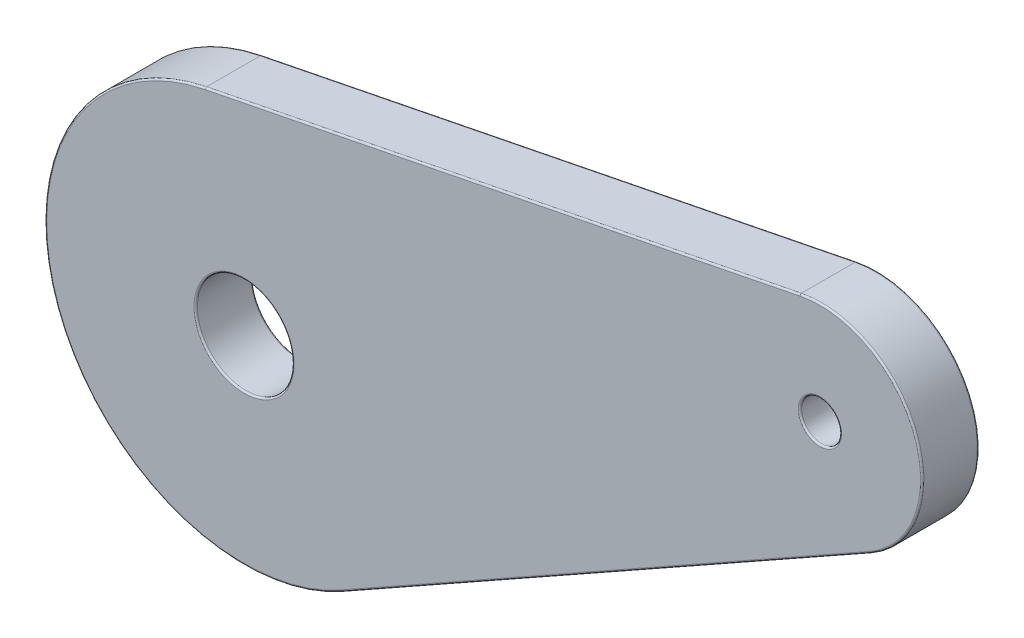
ISO-10303-21;
HEADER;
FILE_DESCRIPTION(('STEP AP214'),'2;1');
FILE_NAME('part.step','',(''),(''),'','','');
FILE_SCHEMA(('AUTOMOTIVE_DESIGN { 1 0 10303 214 1 1 1 1 }'));
ENDSEC;
DATA;
#1=APPLICATION_CONTEXT('core data for automotive mechanical design processes');
#2=APPLICATION_PROTOCOL_DEFINITION('international standard','automotive_design',2000,#1);
#3=PRODUCT_CONTEXT('',#1,'mechanical');
#4=PRODUCT('Part','Part','',(#3));
#5=PRODUCT_RELATED_PRODUCT_CATEGORY('part','',(#4));
#6=PRODUCT_DEFINITION_FORMATION('','',#4);
#7=PRODUCT_DEFINITION_CONTEXT('part definition',#1,'design');
#8=PRODUCT_DEFINITION('design','',#6,#7);
#9=PRODUCT_DEFINITION_SHAPE('','',#8);
#10=(LENGTH_UNIT() NAMED_UNIT(*) SI_UNIT(.MILLI.,.METRE.));
#11=(NAMED_UNIT(*) PLANE_ANGLE_UNIT() SI_UNIT($,.RADIAN.));
#12=(NAMED_UNIT(*) SI_UNIT($,.STERADIAN.) SOLID_ANGLE_UNIT());
#13=UNCERTAINTY_MEASURE_WITH_UNIT(LENGTH_MEASURE(1.E-05),#10,'distance_accuracy_value','');
#14=(GEOMETRIC_REPRESENTATION_CONTEXT(3) GLOBAL_UNCERTAINTY_ASSIGNED_CONTEXT((#13)) GLOBAL_UNIT_ASSIGNED_CONTEXT((#10,
#11,#12)) REPRESENTATION_CONTEXT('',''));
#15=CARTESIAN_POINT('',(0.,0.,0.));
#16=DIRECTION('',(0.,0.,1.));
#17=DIRECTION('',(1.,0.,0.));
#18=AXIS2_PLACEMENT_3D('',#15,#16,#17);
#19=CARTESIAN_POINT('',(-20.2200000000001,57.5800000000001,5.));
#20=DIRECTION('',(0.,0.,1.));
#21=DIRECTION('',(1.,0.,0.));
#22=AXIS2_PLACEMENT_3D('',#19,#20,#21);
#23=PLANE('',#22);
#24=CARTESIAN_POINT('',(-20.2200000000001,57.5800000000001,5.));
#25=DIRECTION('',(0.,0.,1.));
#26=DIRECTION('',(1.,0.,0.));
#27=AXIS2_PLACEMENT_3D('',#24,#25,#26);
#28=CIRCLE('',#27,4.4);
#29=CARTESIAN_POINT('',(-15.8200000000001,57.5800000000001,5.));
#30=VERTEX_POINT('',#29);
#31=EDGE_CURVE('E125',#30,#30,#28,.F.);
#32=ORIENTED_EDGE('',*,*,#31,.T.);
#33=EDGE_LOOP('',(#32));
#34=FACE_BOUND('',#33,.T.);
#35=CARTESIAN_POINT('',(30.4151368034538,76.3438727584557,5.));
#36=DIRECTION('',(0.,0.,1.));
#37=DIRECTION('',(1.,0.,0.));
#38=AXIS2_PLACEMENT_3D('',#35,#36,#37);
#39=CIRCLE('',#38,8.84999999999999);
#40=CARTESIAN_POINT('',(34.7582420573843,68.6328458000486,5.));
#41=VERTEX_POINT('',#40);
#42=CARTESIAN_POINT('',(28.6845337210184,85.0230151683407,5.));
#43=VERTEX_POINT('',#42);
#44=EDGE_CURVE('E123',#41,#43,#39,.T.);
#45=ORIENTED_EDGE('',*,*,#44,.T.);
#46=DIRECTION('',(-0.980694057614127,-0.195548370896662,0.));
#47=VECTOR('',#46,1.);
#48=CARTESIAN_POINT('',(-23.6127642350572,74.5950418996051,5.));
#49=LINE('',#48,#47);
#50=CARTESIAN_POINT('',(-23.6127642350572,74.5950418996051,5.));
#51=VERTEX_POINT('',#50);
#52=EDGE_CURVE('E104',#43,#51,#49,.T.);
#53=ORIENTED_EDGE('',*,*,#52,.T.);
#54=CARTESIAN_POINT('',(-20.2200000000001,57.5800000000001,5.));
#55=DIRECTION('',(0.,0.,1.));
#56=DIRECTION('',(1.,0.,0.));
#57=AXIS2_PLACEMENT_3D('',#54,#55,#56);
#58=CIRCLE('',#57,17.35);
#59=CARTESIAN_POINT('',(-11.7055507168708,42.4629019515975,5.));
#60=VERTEX_POINT('',#59);
#61=EDGE_CURVE('E112',#51,#60,#58,.T.);
#62=ORIENTED_EDGE('',*,*,#61,.T.);
#63=DIRECTION('',(0.871302481175943,0.490746356376331,0.));
#64=VECTOR('',#63,1.);
#65=CARTESIAN_POINT('',(34.7582420573843,68.6328458000486,5.));
#66=LINE('',#65,#64);
#67=EDGE_CURVE('E118',#60,#41,#66,.T.);
#68=ORIENTED_EDGE('',*,*,#67,.T.);
#69=EDGE_LOOP('',(#45,#53,#62,#68));
#70=FACE_BOUND('',#69,.T.);
#71=CARTESIAN_POINT('',(30.4151368034538,76.3438727584557,5.));
#72=DIRECTION('',(0.,0.,1.));
#73=DIRECTION('',(1.,0.,0.));
#74=AXIS2_PLACEMENT_3D('',#71,#72,#73);
#75=CIRCLE('',#74,1.90000000000003);
#76=CARTESIAN_POINT('',(32.3151368034539,76.3438727584557,5.));
#77=VERTEX_POINT('',#76);
#78=EDGE_CURVE('E119',#77,#77,#75,.F.);
#79=ORIENTED_EDGE('',*,*,#78,.T.);
#80=EDGE_LOOP('',(#79));
#81=FACE_BOUND('',#80,.T.);
#82=ADVANCED_FACE('F32',(#34,#70,#81),#23,.T.);
#83=CARTESIAN_POINT('',(-20.2200000000001,57.5800000000001,0.));
#84=DIRECTION('',(0.,0.,1.));
#85=DIRECTION('',(1.,0.,0.));
#86=AXIS2_PLACEMENT_3D('',#83,#84,#85);
#87=PLANE('',#86);
#88=CARTESIAN_POINT('',(-20.2200000000001,57.5800000000001,0.));
#89=DIRECTION('',(0.,0.,1.));
#90=DIRECTION('',(1.,0.,0.));
#91=AXIS2_PLACEMENT_3D('',#88,#89,#90);
#92=CIRCLE('',#91,4.4);
#93=CARTESIAN_POINT('',(-15.8200000000001,57.5800000000001,0.));
#94=VERTEX_POINT('',#93);
#95=EDGE_CURVE('E11',#94,#94,#92,.T.);
#96=ORIENTED_EDGE('',*,*,#95,.T.);
#97=EDGE_LOOP('',(#96));
#98=FACE_BOUND('',#97,.T.);
#99=CARTESIAN_POINT('',(30.4151368034538,76.3438727584557,0.));
#100=DIRECTION('',(0.,0.,1.));
#101=DIRECTION('',(1.,0.,0.));
#102=AXIS2_PLACEMENT_3D('',#99,#100,#101);
#103=CIRCLE('',#102,1.90000000000003);
#104=CARTESIAN_POINT('',(32.3151368034539,76.3438727584557,0.));
#105=VERTEX_POINT('',#104);
#106=EDGE_CURVE('E41',#105,#105,#103,.T.);
#107=ORIENTED_EDGE('',*,*,#106,.T.);
#108=EDGE_LOOP('',(#107));
#109=FACE_BOUND('',#108,.T.);
#110=CARTESIAN_POINT('',(30.4151368034538,76.3438727584557,0.));
#111=DIRECTION('',(0.,0.,1.));
#112=DIRECTION('',(1.,0.,0.));
#113=AXIS2_PLACEMENT_3D('',#110,#111,#112);
#114=CIRCLE('',#113,8.84999999999999);
#115=CARTESIAN_POINT('',(28.6845337210184,85.0230151683407,0.));
#116=VERTEX_POINT('',#115);
#117=CARTESIAN_POINT('',(34.7582420573843,68.6328458000486,0.));
#118=VERTEX_POINT('',#117);
#119=EDGE_CURVE('E49',#116,#118,#114,.F.);
#120=ORIENTED_EDGE('',*,*,#119,.T.);
#121=DIRECTION('',(0.871302481175943,0.490746356376331,0.));
#122=VECTOR('',#121,1.);
#123=CARTESIAN_POINT('',(-11.7055507168708,42.4629019515975,0.));
#124=LINE('',#123,#122);
#125=CARTESIAN_POINT('',(-11.7055507168708,42.4629019515975,0.));
#126=VERTEX_POINT('',#125);
#127=EDGE_CURVE('E158',#118,#126,#124,.F.);
#128=ORIENTED_EDGE('',*,*,#127,.T.);
#129=CARTESIAN_POINT('',(-20.2200000000001,57.5800000000001,0.));
#130=DIRECTION('',(0.,0.,1.));
#131=DIRECTION('',(1.,0.,0.));
#132=AXIS2_PLACEMENT_3D('',#129,#130,#131);
#133=CIRCLE('',#132,17.35);
#134=CARTESIAN_POINT('',(-23.6127642350572,74.5950418996051,0.));
#135=VERTEX_POINT('',#134);
#136=EDGE_CURVE('E154',#126,#135,#133,.F.);
#137=ORIENTED_EDGE('',*,*,#136,.T.);
#138=DIRECTION('',(-0.980694057614127,-0.195548370896662,0.));
#139=VECTOR('',#138,1.);
#140=CARTESIAN_POINT('',(-23.6127642350572,74.5950418996051,0.));
#141=LINE('',#140,#139);
#142=EDGE_CURVE('E54',#135,#116,#141,.F.);
#143=ORIENTED_EDGE('',*,*,#142,.T.);
#144=EDGE_LOOP('',(#120,#128,#137,#143));
#145=FACE_BOUND('',#144,.T.);
#146=ADVANCED_FACE('F189',(#98,#109,#145),#87,.F.);
#147=CARTESIAN_POINT('',(-20.2200000000001,57.5800000000001,5.));
#148=DIRECTION('',(0.,0.,-1.));
#149=DIRECTION('',(-1.,0.,0.));
#150=AXIS2_PLACEMENT_3D('',#147,#148,#149);
#151=CYLINDRICAL_SURFACE('',#150,17.5);
#152=DIRECTION('',(0.,0.,-1.));
#153=VECTOR('',#152,1.);
#154=CARTESIAN_POINT('',(-11.6319387634143,42.3322065794211,5.));
#155=LINE('',#154,#153);
#156=CARTESIAN_POINT('',(-11.6319387634143,42.3322065794211,4.85));
#157=VERTEX_POINT('',#156);
#158=CARTESIAN_POINT('',(-11.6319387634143,42.3322065794211,0.15));
#159=VERTEX_POINT('',#158);
#160=EDGE_CURVE('E388',#157,#159,#155,.T.);
#161=ORIENTED_EDGE('',*,*,#160,.F.);
#162=CARTESIAN_POINT('',(-20.2200000000001,57.5800000000001,4.85));
#163=DIRECTION('',(0.,0.,1.));
#164=DIRECTION('',(1.,0.,0.));
#165=AXIS2_PLACEMENT_3D('',#162,#163,#164);
#166=CIRCLE('',#165,17.5);
#167=CARTESIAN_POINT('',(-23.6420964906917,74.7421460082473,4.85));
#168=VERTEX_POINT('',#167);
#169=EDGE_CURVE('E146',#157,#168,#166,.F.);
#170=ORIENTED_EDGE('',*,*,#169,.T.);
#171=DIRECTION('',(0.,0.,-1.));
#172=VECTOR('',#171,1.);
#173=CARTESIAN_POINT('',(-23.6420964906917,74.7421460082473,5.));
#174=LINE('',#173,#172);
#175=CARTESIAN_POINT('',(-23.6420964906917,74.7421460082473,0.15));
#176=VERTEX_POINT('',#175);
#177=EDGE_CURVE('E167',#168,#176,#174,.T.);
#178=ORIENTED_EDGE('',*,*,#177,.T.);
#179=CARTESIAN_POINT('',(-20.2200000000001,57.5800000000001,0.15));
#180=DIRECTION('',(0.,0.,1.));
#181=DIRECTION('',(1.,0.,0.));
#182=AXIS2_PLACEMENT_3D('',#179,#180,#181);
#183=CIRCLE('',#182,17.5);
#184=EDGE_CURVE('E144',#176,#159,#183,.T.);
#185=ORIENTED_EDGE('',*,*,#184,.T.);
#186=EDGE_LOOP('',(#161,#170,#178,#185));
#187=FACE_BOUND('',#186,.T.);
#188=ADVANCED_FACE('F191',(#187),#151,.T.);
#189=CARTESIAN_POINT('',(34.8318540108408,68.5021504278722,5.));
#190=DIRECTION('',(-0.490746356376331,0.871302481175943,0.));
#191=DIRECTION('',(-0.871302481175943,-0.490746356376331,0.));
#192=AXIS2_PLACEMENT_3D('',#189,#190,#191);
#193=PLANE('',#192);
#194=DIRECTION('',(0.,0.,-1.));
#195=VECTOR('',#194,1.);
#196=CARTESIAN_POINT('',(34.8318540108408,68.5021504278722,5.));
#197=LINE('',#196,#195);
#198=CARTESIAN_POINT('',(34.8318540108408,68.5021504278722,4.85));
#199=VERTEX_POINT('',#198);
#200=CARTESIAN_POINT('',(34.8318540108408,68.5021504278722,0.15));
#201=VERTEX_POINT('',#200);
#202=EDGE_CURVE('E392',#199,#201,#197,.T.);
#203=ORIENTED_EDGE('',*,*,#202,.F.);
#204=DIRECTION('',(0.871302481175943,0.490746356376331,0.));
#205=VECTOR('',#204,1.);
#206=CARTESIAN_POINT('',(-11.6319387634143,42.3322065794211,4.85));
#207=LINE('',#206,#205);
#208=EDGE_CURVE('E142',#199,#157,#207,.F.);
#209=ORIENTED_EDGE('',*,*,#208,.T.);
#210=ORIENTED_EDGE('',*,*,#160,.T.);
#211=DIRECTION('',(0.871302481175943,0.490746356376331,0.));
#212=VECTOR('',#211,1.);
#213=CARTESIAN_POINT('',(34.8318540108408,68.5021504278722,0.15));
#214=LINE('',#213,#212);
#215=EDGE_CURVE('E139',#159,#201,#214,.T.);
#216=ORIENTED_EDGE('',*,*,#215,.T.);
#217=EDGE_LOOP('',(#203,#209,#210,#216));
#218=FACE_BOUND('',#217,.T.);
#219=ADVANCED_FACE('F198',(#218),#193,.F.);
#220=CARTESIAN_POINT('',(30.4151368034538,76.3438727584557,5.));
#221=DIRECTION('',(0.,0.,-1.));
#222=DIRECTION('',(-1.,0.,0.));
#223=AXIS2_PLACEMENT_3D('',#220,#221,#222);
#224=CYLINDRICAL_SURFACE('',#223,8.99999999999999);
#225=DIRECTION('',(0.,0.,-1.));
#226=VECTOR('',#225,1.);
#227=CARTESIAN_POINT('',(28.6552014653839,85.1701192769828,5.));
#228=LINE('',#227,#226);
#229=CARTESIAN_POINT('',(28.6552014653839,85.1701192769828,4.85));
#230=VERTEX_POINT('',#229);
#231=CARTESIAN_POINT('',(28.6552014653839,85.1701192769828,0.15));
#232=VERTEX_POINT('',#231);
#233=EDGE_CURVE('E405',#230,#232,#228,.T.);
#234=ORIENTED_EDGE('',*,*,#233,.F.);
#235=CARTESIAN_POINT('',(30.4151368034538,76.3438727584557,4.85));
#236=DIRECTION('',(0.,0.,1.));
#237=DIRECTION('',(1.,0.,0.));
#238=AXIS2_PLACEMENT_3D('',#235,#236,#237);
#239=CIRCLE('',#238,8.99999999999999);
#240=EDGE_CURVE('E137',#230,#199,#239,.F.);
#241=ORIENTED_EDGE('',*,*,#240,.T.);
#242=ORIENTED_EDGE('',*,*,#202,.T.);
#243=CARTESIAN_POINT('',(30.4151368034538,76.3438727584557,0.15));
#244=DIRECTION('',(0.,0.,1.));
#245=DIRECTION('',(1.,0.,0.));
#246=AXIS2_PLACEMENT_3D('',#243,#244,#245);
#247=CIRCLE('',#246,8.99999999999999);
#248=EDGE_CURVE('E135',#201,#232,#247,.T.);
#249=ORIENTED_EDGE('',*,*,#248,.T.);
#250=EDGE_LOOP('',(#234,#241,#242,#249));
#251=FACE_BOUND('',#250,.T.);
#252=ADVANCED_FACE('F210',(#251),#224,.T.);
#253=CARTESIAN_POINT('',(-23.6420964906917,74.7421460082473,5.));
#254=DIRECTION('',(0.195548370896662,-0.980694057614127,0.));
#255=DIRECTION('',(0.980694057614127,0.195548370896662,0.));
#256=AXIS2_PLACEMENT_3D('',#253,#254,#255);
#257=PLANE('',#256);
#258=ORIENTED_EDGE('',*,*,#177,.F.);
#259=DIRECTION('',(-0.980694057614127,-0.195548370896662,0.));
#260=VECTOR('',#259,1.);
#261=CARTESIAN_POINT('',(28.6552014653839,85.1701192769828,4.85));
#262=LINE('',#261,#260);
#263=EDGE_CURVE('E106',#168,#230,#262,.F.);
#264=ORIENTED_EDGE('',*,*,#263,.T.);
#265=ORIENTED_EDGE('',*,*,#233,.T.);
#266=DIRECTION('',(-0.980694057614127,-0.195548370896662,0.));
#267=VECTOR('',#266,1.);
#268=CARTESIAN_POINT('',(-23.6420964906917,74.7421460082473,0.15));
#269=LINE('',#268,#267);
#270=EDGE_CURVE('E128',#232,#176,#269,.T.);
#271=ORIENTED_EDGE('',*,*,#270,.T.);
#272=EDGE_LOOP('',(#258,#264,#265,#271));
#273=FACE_BOUND('',#272,.T.);
#274=ADVANCED_FACE('F206',(#273),#257,.F.);
#275=CARTESIAN_POINT('',(30.4151368034538,76.3438727584557,5.));
#276=DIRECTION('',(0.,0.,-1.));
#277=DIRECTION('',(-1.,0.,0.));
#278=AXIS2_PLACEMENT_3D('',#275,#276,#277);
#279=CYLINDRICAL_SURFACE('',#278,1.75000000000003);
#280=CARTESIAN_POINT('',(30.4151368034538,76.3438727584557,4.85));
#281=DIRECTION('',(0.,0.,1.));
#282=DIRECTION('',(1.,0.,0.));
#283=AXIS2_PLACEMENT_3D('',#280,#281,#282);
#284=CIRCLE('',#283,1.75000000000003);
#285=CARTESIAN_POINT('',(32.1651368034539,76.3438727584557,4.85));
#286=VERTEX_POINT('',#285);
#287=EDGE_CURVE('E151',#286,#286,#284,.T.);
#288=ORIENTED_EDGE('',*,*,#287,.T.);
#289=EDGE_LOOP('',(#288));
#290=FACE_BOUND('',#289,.T.);
#291=CARTESIAN_POINT('',(30.4151368034538,76.3438727584557,0.15));
#292=DIRECTION('',(0.,0.,1.));
#293=DIRECTION('',(1.,0.,0.));
#294=AXIS2_PLACEMENT_3D('',#291,#292,#293);
#295=CIRCLE('',#294,1.75000000000003);
#296=CARTESIAN_POINT('',(32.1651368034539,76.3438727584557,0.15));
#297=VERTEX_POINT('',#296);
#298=EDGE_CURVE('E148',#297,#297,#295,.F.);
#299=ORIENTED_EDGE('',*,*,#298,.T.);
#300=EDGE_LOOP('',(#299));
#301=FACE_BOUND('',#300,.T.);
#302=ADVANCED_FACE('F209',(#290,#301),#279,.F.);
#303=CARTESIAN_POINT('',(-20.2200000000001,57.5800000000001,5.));
#304=DIRECTION('',(0.,0.,-1.));
#305=DIRECTION('',(-1.,0.,0.));
#306=AXIS2_PLACEMENT_3D('',#303,#304,#305);
#307=CYLINDRICAL_SURFACE('',#306,4.25);
#308=CARTESIAN_POINT('',(-20.2200000000001,57.5800000000001,4.85));
#309=DIRECTION('',(0.,0.,1.));
#310=DIRECTION('',(1.,0.,0.));
#311=AXIS2_PLACEMENT_3D('',#308,#309,#310);
#312=CIRCLE('',#311,4.25);
#313=CARTESIAN_POINT('',(-15.9700000000001,57.5800000000001,4.85));
#314=VERTEX_POINT('',#313);
#315=EDGE_CURVE('E384',#314,#314,#312,.T.);
#316=ORIENTED_EDGE('',*,*,#315,.T.);
#317=EDGE_LOOP('',(#316));
#318=FACE_BOUND('',#317,.T.);
#319=CARTESIAN_POINT('',(-20.2200000000001,57.5800000000001,0.15));
#320=DIRECTION('',(0.,0.,1.));
#321=DIRECTION('',(1.,0.,0.));
#322=AXIS2_PLACEMENT_3D('',#319,#320,#321);
#323=CIRCLE('',#322,4.25);
#324=CARTESIAN_POINT('',(-15.9700000000001,57.5800000000001,0.15));
#325=VERTEX_POINT('',#324);
#326=EDGE_CURVE('E387',#325,#325,#323,.F.);
#327=ORIENTED_EDGE('',*,*,#326,.T.);
#328=EDGE_LOOP('',(#327));
#329=FACE_BOUND('',#328,.T.);
#330=ADVANCED_FACE('F222',(#318,#329),#307,.F.);
#331=CARTESIAN_POINT('',(-20.2200000000001,57.5800000000001,4.85));
#332=DIRECTION('',(0.,0.,1.));
#333=DIRECTION('',(1.,0.,0.));
#334=AXIS2_PLACEMENT_3D('',#331,#332,#333);
#335=TOROIDAL_SURFACE('',#334,4.4,0.15);
#336=ORIENTED_EDGE('',*,*,#31,.F.);
#337=EDGE_LOOP('',(#336));
#338=FACE_BOUND('',#337,.T.);
#339=ORIENTED_EDGE('',*,*,#315,.F.);
#340=EDGE_LOOP('',(#339));
#341=FACE_BOUND('',#340,.T.);
#342=ADVANCED_FACE('F218',(#338,#341),#335,.T.);
#343=CARTESIAN_POINT('',(-11.7055507168708,42.4629019515975,4.85));
#344=DIRECTION('',(-0.871302481175943,-0.490746356376331,0.));
#345=DIRECTION('',(0.490746356376331,-0.871302481175943,0.));
#346=AXIS2_PLACEMENT_3D('',#343,#344,#345);
#347=CYLINDRICAL_SURFACE('',#346,0.15);
#348=CARTESIAN_POINT('',(-11.7055507168708,42.4629019515975,4.85));
#349=DIRECTION('',(-0.871302481175945,-0.490746356376328,0.));
#350=DIRECTION('',(0.490746356376328,-0.871302481175945,0.));
#351=AXIS2_PLACEMENT_3D('',#348,#349,#350);
#352=CIRCLE('',#351,0.15);
#353=EDGE_CURVE('E115',#157,#60,#352,.T.);
#354=ORIENTED_EDGE('',*,*,#353,.F.);
#355=ORIENTED_EDGE('',*,*,#208,.F.);
#356=CARTESIAN_POINT('',(34.7582420573843,68.6328458000486,4.85));
#357=DIRECTION('',(0.871302481175944,0.49074635637633,0.));
#358=DIRECTION('',(-0.49074635637633,0.871302481175944,0.));
#359=AXIS2_PLACEMENT_3D('',#356,#357,#358);
#360=CIRCLE('',#359,0.15);
#361=EDGE_CURVE('E164',#41,#199,#360,.T.);
#362=ORIENTED_EDGE('',*,*,#361,.F.);
#363=ORIENTED_EDGE('',*,*,#67,.F.);
#364=EDGE_LOOP('',(#354,#355,#362,#363));
#365=FACE_BOUND('',#364,.T.);
#366=ADVANCED_FACE('F221',(#365),#347,.T.);
#367=CARTESIAN_POINT('',(30.4151368034538,76.3438727584557,4.85));
#368=DIRECTION('',(0.,0.,1.));
#369=DIRECTION('',(1.,0.,0.));
#370=AXIS2_PLACEMENT_3D('',#367,#368,#369);
#371=TOROIDAL_SURFACE('',#370,8.84999999999999,0.15);
#372=ORIENTED_EDGE('',*,*,#361,.T.);
#373=ORIENTED_EDGE('',*,*,#240,.F.);
#374=CARTESIAN_POINT('',(28.6845337210184,85.0230151683407,4.85));
#375=DIRECTION('',(-0.980694057614127,-0.195548370896665,0.));
#376=DIRECTION('',(0.195548370896665,-0.980694057614127,0.));
#377=AXIS2_PLACEMENT_3D('',#374,#375,#376);
#378=CIRCLE('',#377,0.15);
#379=EDGE_CURVE('E109',#43,#230,#378,.T.);
#380=ORIENTED_EDGE('',*,*,#379,.F.);
#381=ORIENTED_EDGE('',*,*,#44,.F.);
#382=EDGE_LOOP('',(#372,#373,#380,#381));
#383=FACE_BOUND('',#382,.T.);
#384=ADVANCED_FACE('F229',(#383),#371,.T.);
#385=CARTESIAN_POINT('',(-20.2200000000001,57.5800000000001,4.85));
#386=DIRECTION('',(0.,0.,1.));
#387=DIRECTION('',(1.,0.,0.));
#388=AXIS2_PLACEMENT_3D('',#385,#386,#387);
#389=TOROIDAL_SURFACE('',#388,17.35,0.15);
#390=ORIENTED_EDGE('',*,*,#353,.T.);
#391=ORIENTED_EDGE('',*,*,#61,.F.);
#392=CARTESIAN_POINT('',(-23.6127642350572,74.5950418996051,4.85));
#393=DIRECTION('',(0.980694057614127,0.195548370896665,0.));
#394=DIRECTION('',(-0.195548370896665,0.980694057614127,0.));
#395=AXIS2_PLACEMENT_3D('',#392,#393,#394);
#396=CIRCLE('',#395,0.15);
#397=EDGE_CURVE('E100',#168,#51,#396,.T.);
#398=ORIENTED_EDGE('',*,*,#397,.F.);
#399=ORIENTED_EDGE('',*,*,#169,.F.);
#400=EDGE_LOOP('',(#390,#391,#398,#399));
#401=FACE_BOUND('',#400,.T.);
#402=ADVANCED_FACE('F113',(#401),#389,.T.);
#403=CARTESIAN_POINT('',(-23.6127642350572,74.5950418996051,4.85));
#404=DIRECTION('',(0.980694057614127,0.195548370896662,0.));
#405=DIRECTION('',(-0.195548370896662,0.980694057614127,0.));
#406=AXIS2_PLACEMENT_3D('',#403,#404,#405);
#407=CYLINDRICAL_SURFACE('',#406,0.15);
#408=ORIENTED_EDGE('',*,*,#379,.T.);
#409=ORIENTED_EDGE('',*,*,#263,.F.);
#410=ORIENTED_EDGE('',*,*,#397,.T.);
#411=ORIENTED_EDGE('',*,*,#52,.F.);
#412=EDGE_LOOP('',(#408,#409,#410,#411));
#413=FACE_BOUND('',#412,.T.);
#414=ADVANCED_FACE('F102',(#413),#407,.T.);
#415=CARTESIAN_POINT('',(30.4151368034538,76.3438727584557,4.85));
#416=DIRECTION('',(0.,0.,1.));
#417=DIRECTION('',(1.,0.,0.));
#418=AXIS2_PLACEMENT_3D('',#415,#416,#417);
#419=TOROIDAL_SURFACE('',#418,1.90000000000003,0.15);
#420=ORIENTED_EDGE('',*,*,#78,.F.);
#421=EDGE_LOOP('',(#420));
#422=FACE_BOUND('',#421,.T.);
#423=ORIENTED_EDGE('',*,*,#287,.F.);
#424=EDGE_LOOP('',(#423));
#425=FACE_BOUND('',#424,.T.);
#426=ADVANCED_FACE('F226',(#422,#425),#419,.T.);
#427=CARTESIAN_POINT('',(-20.2200000000001,57.5800000000001,0.15));
#428=DIRECTION('',(0.,0.,1.));
#429=DIRECTION('',(1.,0.,0.));
#430=AXIS2_PLACEMENT_3D('',#427,#428,#429);
#431=TOROIDAL_SURFACE('',#430,4.4,0.15);
#432=ORIENTED_EDGE('',*,*,#326,.F.);
#433=EDGE_LOOP('',(#432));
#434=FACE_BOUND('',#433,.T.);
#435=ORIENTED_EDGE('',*,*,#95,.F.);
#436=EDGE_LOOP('',(#435));
#437=FACE_BOUND('',#436,.T.);
#438=ADVANCED_FACE('F238',(#434,#437),#431,.T.);
#439=CARTESIAN_POINT('',(30.4151368034538,76.3438727584557,0.15));
#440=DIRECTION('',(0.,0.,1.));
#441=DIRECTION('',(1.,0.,0.));
#442=AXIS2_PLACEMENT_3D('',#439,#440,#441);
#443=TOROIDAL_SURFACE('',#442,1.90000000000003,0.15);
#444=ORIENTED_EDGE('',*,*,#298,.F.);
#445=EDGE_LOOP('',(#444));
#446=FACE_BOUND('',#445,.T.);
#447=ORIENTED_EDGE('',*,*,#106,.F.);
#448=EDGE_LOOP('',(#447));
#449=FACE_BOUND('',#448,.T.);
#450=ADVANCED_FACE('F242',(#446,#449),#443,.T.);
#451=CARTESIAN_POINT('',(-23.6127642350572,74.5950418996051,0.15));
#452=DIRECTION('',(-0.980694057614127,-0.195548370896662,0.));
#453=DIRECTION('',(0.195548370896662,-0.980694057614127,0.));
#454=AXIS2_PLACEMENT_3D('',#451,#452,#453);
#455=CYLINDRICAL_SURFACE('',#454,0.15);
#456=CARTESIAN_POINT('',(28.6845337210184,85.0230151683407,0.15));
#457=DIRECTION('',(0.980694057614127,0.195548370896665,0.));
#458=DIRECTION('',(-0.195548370896665,0.980694057614127,0.));
#459=AXIS2_PLACEMENT_3D('',#456,#457,#458);
#460=CIRCLE('',#459,0.15);
#461=EDGE_CURVE('E171',#116,#232,#460,.T.);
#462=ORIENTED_EDGE('',*,*,#461,.F.);
#463=ORIENTED_EDGE('',*,*,#142,.F.);
#464=CARTESIAN_POINT('',(-23.6127642350572,74.5950418996051,0.15));
#465=DIRECTION('',(-0.980694057614127,-0.195548370896665,0.));
#466=DIRECTION('',(0.195548370896665,-0.980694057614127,0.));
#467=AXIS2_PLACEMENT_3D('',#464,#465,#466);
#468=CIRCLE('',#467,0.15);
#469=EDGE_CURVE('E36',#176,#135,#468,.T.);
#470=ORIENTED_EDGE('',*,*,#469,.F.);
#471=ORIENTED_EDGE('',*,*,#270,.F.);
#472=EDGE_LOOP('',(#462,#463,#470,#471));
#473=FACE_BOUND('',#472,.T.);
#474=ADVANCED_FACE('F34',(#473),#455,.T.);
#475=CARTESIAN_POINT('',(-20.2200000000001,57.5800000000001,0.15));
#476=DIRECTION('',(0.,0.,1.));
#477=DIRECTION('',(1.,0.,0.));
#478=AXIS2_PLACEMENT_3D('',#475,#476,#477);
#479=TOROIDAL_SURFACE('',#478,17.35,0.15);
#480=ORIENTED_EDGE('',*,*,#469,.T.);
#481=ORIENTED_EDGE('',*,*,#136,.F.);
#482=CARTESIAN_POINT('',(-11.7055507168708,42.4629019515975,0.15));
#483=DIRECTION('',(0.871302481175945,0.490746356376328,0.));
#484=DIRECTION('',(-0.490746356376328,0.871302481175945,0.));
#485=AXIS2_PLACEMENT_3D('',#482,#483,#484);
#486=CIRCLE('',#485,0.15);
#487=EDGE_CURVE('E170',#159,#126,#486,.T.);
#488=ORIENTED_EDGE('',*,*,#487,.F.);
#489=ORIENTED_EDGE('',*,*,#184,.F.);
#490=EDGE_LOOP('',(#480,#481,#488,#489));
#491=FACE_BOUND('',#490,.T.);
#492=ADVANCED_FACE('F180',(#491),#479,.T.);
#493=CARTESIAN_POINT('',(30.4151368034538,76.3438727584557,0.15));
#494=DIRECTION('',(0.,0.,1.));
#495=DIRECTION('',(1.,0.,0.));
#496=AXIS2_PLACEMENT_3D('',#493,#494,#495);
#497=TOROIDAL_SURFACE('',#496,8.84999999999999,0.15);
#498=ORIENTED_EDGE('',*,*,#461,.T.);
#499=ORIENTED_EDGE('',*,*,#248,.F.);
#500=CARTESIAN_POINT('',(34.7582420573843,68.6328458000486,0.15));
#501=DIRECTION('',(-0.871302481175944,-0.49074635637633,0.));
#502=DIRECTION('',(0.49074635637633,-0.871302481175944,0.));
#503=AXIS2_PLACEMENT_3D('',#500,#501,#502);
#504=CIRCLE('',#503,0.15);
#505=EDGE_CURVE('E168',#118,#201,#504,.T.);
#506=ORIENTED_EDGE('',*,*,#505,.F.);
#507=ORIENTED_EDGE('',*,*,#119,.F.);
#508=EDGE_LOOP('',(#498,#499,#506,#507));
#509=FACE_BOUND('',#508,.T.);
#510=ADVANCED_FACE('F185',(#509),#497,.T.);
#511=CARTESIAN_POINT('',(34.7582420573844,68.6328458000486,0.15));
#512=DIRECTION('',(0.871302481175943,0.490746356376331,0.));
#513=DIRECTION('',(-0.490746356376331,0.871302481175943,0.));
#514=AXIS2_PLACEMENT_3D('',#511,#512,#513);
#515=CYLINDRICAL_SURFACE('',#514,0.15);
#516=ORIENTED_EDGE('',*,*,#487,.T.);
#517=ORIENTED_EDGE('',*,*,#127,.F.);
#518=ORIENTED_EDGE('',*,*,#505,.T.);
#519=ORIENTED_EDGE('',*,*,#215,.F.);
#520=EDGE_LOOP('',(#516,#517,#518,#519));
#521=FACE_BOUND('',#520,.T.);
#522=ADVANCED_FACE('F188',(#521),#515,.T.);
#523=CLOSED_SHELL('',(#82,#146,#188,#219,#252,#274,#302,#330,#342,#366,#384,#402,#414,#426,#438,
#450,#474,#492,#510,#522));
#524=MANIFOLD_SOLID_BREP('B2',#523);
#525=ADVANCED_BREP_SHAPE_REPRESENTATION('',(#18,#524),#14);
#526=SHAPE_DEFINITION_REPRESENTATION(#9,#525);
ENDSEC;
END-ISO-10303-21;
